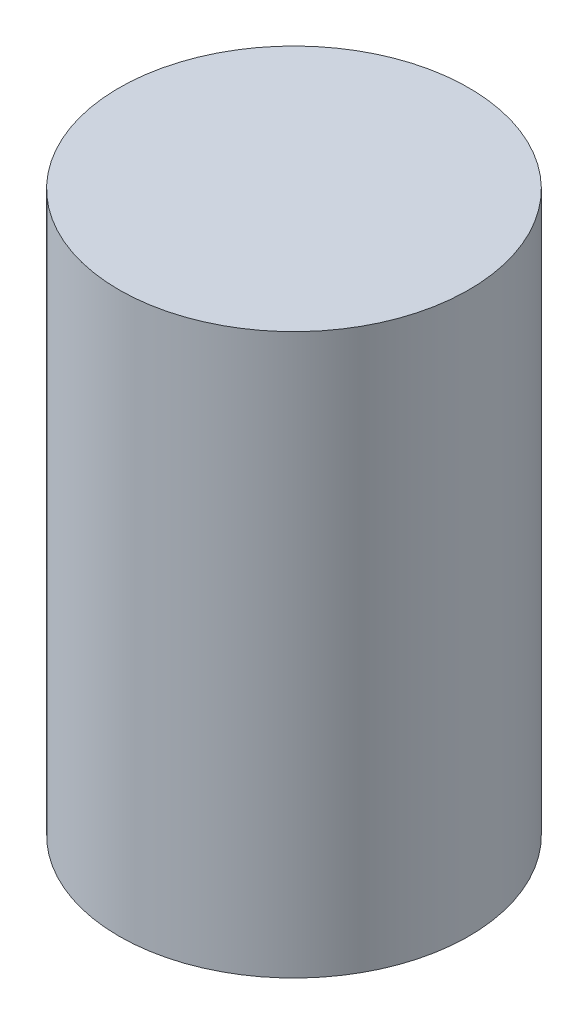
ISO-10303-21;
HEADER;
FILE_DESCRIPTION(('STEP AP214'),'2;1');
FILE_NAME('part.step','',(''),(''),'','','');
FILE_SCHEMA(('AUTOMOTIVE_DESIGN { 1 0 10303 214 1 1 1 1 }'));
ENDSEC;
DATA;
#1=APPLICATION_CONTEXT('core data for automotive mechanical design processes');
#2=APPLICATION_PROTOCOL_DEFINITION('international standard','automotive_design',2000,#1);
#3=PRODUCT_CONTEXT('',#1,'mechanical');
#4=PRODUCT('Part','Part','',(#3));
#5=PRODUCT_RELATED_PRODUCT_CATEGORY('part','',(#4));
#6=PRODUCT_DEFINITION_FORMATION('','',#4);
#7=PRODUCT_DEFINITION_CONTEXT('part definition',#1,'design');
#8=PRODUCT_DEFINITION('design','',#6,#7);
#9=PRODUCT_DEFINITION_SHAPE('','',#8);
#10=(LENGTH_UNIT() NAMED_UNIT(*) SI_UNIT(.MILLI.,.METRE.));
#11=(NAMED_UNIT(*) PLANE_ANGLE_UNIT() SI_UNIT($,.RADIAN.));
#12=(NAMED_UNIT(*) SI_UNIT($,.STERADIAN.) SOLID_ANGLE_UNIT());
#13=UNCERTAINTY_MEASURE_WITH_UNIT(LENGTH_MEASURE(1.E-05),#10,'distance_accuracy_value','');
#14=(GEOMETRIC_REPRESENTATION_CONTEXT(3) GLOBAL_UNCERTAINTY_ASSIGNED_CONTEXT((#13)) GLOBAL_UNIT_ASSIGNED_CONTEXT((#10,
#11,#12)) REPRESENTATION_CONTEXT('',''));
#15=CARTESIAN_POINT('',(0.,0.,0.));
#16=DIRECTION('',(0.,0.,1.));
#17=DIRECTION('',(1.,0.,0.));
#18=AXIS2_PLACEMENT_3D('',#15,#16,#17);
#19=CARTESIAN_POINT('',(0.,8.,0.));
#20=DIRECTION('',(0.,-1.,0.));
#21=DIRECTION('',(0.,0.,-1.));
#22=AXIS2_PLACEMENT_3D('',#19,#20,#21);
#23=CYLINDRICAL_SURFACE('',#22,2.5);
#24=CARTESIAN_POINT('',(0.,8.,0.));
#25=DIRECTION('',(0.,1.,0.));
#26=DIRECTION('',(0.,0.,1.));
#27=AXIS2_PLACEMENT_3D('',#24,#25,#26);
#28=CIRCLE('',#27,2.5);
#29=CARTESIAN_POINT('',(0.,8.,2.5));
#30=VERTEX_POINT('',#29);
#31=EDGE_CURVE('E10',#30,#30,#28,.T.);
#32=ORIENTED_EDGE('',*,*,#31,.F.);
#33=EDGE_LOOP('',(#32));
#34=FACE_BOUND('',#33,.T.);
#35=CARTESIAN_POINT('',(0.,0.,0.));
#36=DIRECTION('',(0.,1.,0.));
#37=DIRECTION('',(0.,0.,1.));
#38=AXIS2_PLACEMENT_3D('',#35,#36,#37);
#39=CIRCLE('',#38,2.5);
#40=CARTESIAN_POINT('',(0.,0.,2.5));
#41=VERTEX_POINT('',#40);
#42=EDGE_CURVE('E46',#41,#41,#39,.T.);
#43=ORIENTED_EDGE('',*,*,#42,.T.);
#44=EDGE_LOOP('',(#43));
#45=FACE_BOUND('',#44,.T.);
#46=ADVANCED_FACE('F43',(#34,#45),#23,.T.);
#47=CARTESIAN_POINT('',(0.,8.,0.));
#48=DIRECTION('',(0.,1.,0.));
#49=DIRECTION('',(0.,0.,1.));
#50=AXIS2_PLACEMENT_3D('',#47,#48,#49);
#51=PLANE('',#50);
#52=ORIENTED_EDGE('',*,*,#31,.T.);
#53=EDGE_LOOP('',(#52));
#54=FACE_BOUND('',#53,.T.);
#55=ADVANCED_FACE('F60',(#54),#51,.T.);
#56=CARTESIAN_POINT('',(0.,0.,0.));
#57=DIRECTION('',(0.,1.,0.));
#58=DIRECTION('',(0.,0.,1.));
#59=AXIS2_PLACEMENT_3D('',#56,#57,#58);
#60=PLANE('',#59);
#61=ORIENTED_EDGE('',*,*,#42,.F.);
#62=EDGE_LOOP('',(#61));
#63=FACE_BOUND('',#62,.T.);
#64=ADVANCED_FACE('F58',(#63),#60,.F.);
#65=CLOSED_SHELL('',(#46,#55,#64));
#66=MANIFOLD_SOLID_BREP('B2',#65);
#67=ADVANCED_BREP_SHAPE_REPRESENTATION('',(#18,#66),#14);
#68=SHAPE_DEFINITION_REPRESENTATION(#9,#67);
ENDSEC;
END-ISO-10303-21;
